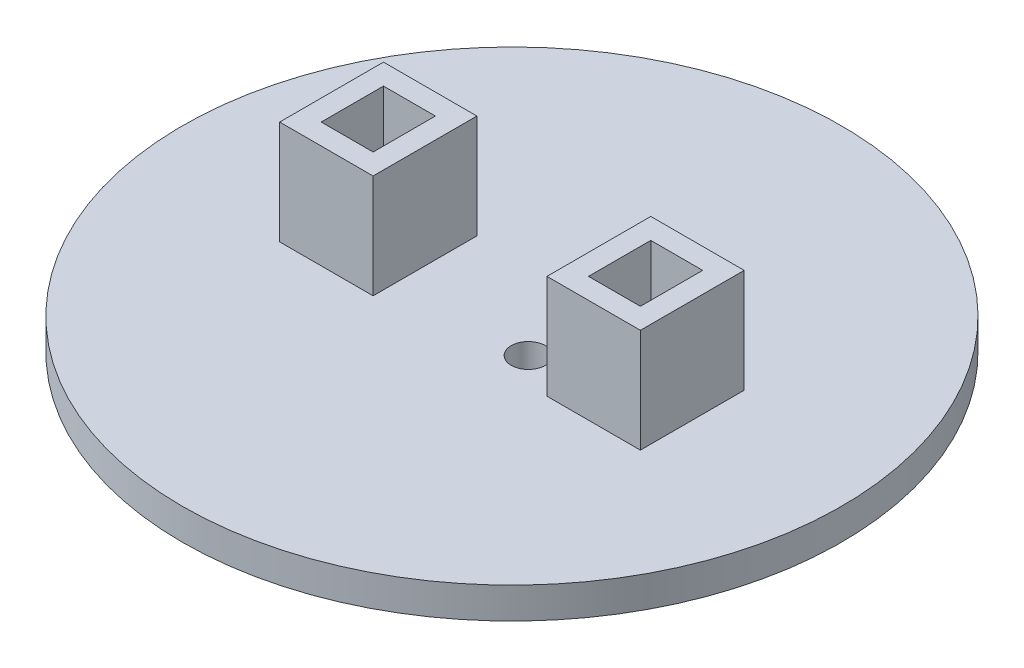
ISO-10303-21;
HEADER;
FILE_DESCRIPTION(('STEP AP214'),'2;1');
FILE_NAME('part.step','',(''),(''),'','','');
FILE_SCHEMA(('AUTOMOTIVE_DESIGN { 1 0 10303 214 1 1 1 1 }'));
ENDSEC;
DATA;
#1=APPLICATION_CONTEXT('core data for automotive mechanical design processes');
#2=APPLICATION_PROTOCOL_DEFINITION('international standard','automotive_design',2000,#1);
#3=PRODUCT_CONTEXT('',#1,'mechanical');
#4=PRODUCT('Part','Part','',(#3));
#5=PRODUCT_RELATED_PRODUCT_CATEGORY('part','',(#4));
#6=PRODUCT_DEFINITION_FORMATION('','',#4);
#7=PRODUCT_DEFINITION_CONTEXT('part definition',#1,'design');
#8=PRODUCT_DEFINITION('design','',#6,#7);
#9=PRODUCT_DEFINITION_SHAPE('','',#8);
#10=(LENGTH_UNIT() NAMED_UNIT(*) SI_UNIT(.MILLI.,.METRE.));
#11=(NAMED_UNIT(*) PLANE_ANGLE_UNIT() SI_UNIT($,.RADIAN.));
#12=(NAMED_UNIT(*) SI_UNIT($,.STERADIAN.) SOLID_ANGLE_UNIT());
#13=UNCERTAINTY_MEASURE_WITH_UNIT(LENGTH_MEASURE(1.E-05),#10,'distance_accuracy_value','');
#14=(GEOMETRIC_REPRESENTATION_CONTEXT(3) GLOBAL_UNCERTAINTY_ASSIGNED_CONTEXT((#13)) GLOBAL_UNIT_ASSIGNED_CONTEXT((#10,
#11,#12)) REPRESENTATION_CONTEXT('',''));
#15=CARTESIAN_POINT('',(0.,0.,0.));
#16=DIRECTION('',(0.,0.,1.));
#17=DIRECTION('',(1.,0.,0.));
#18=AXIS2_PLACEMENT_3D('',#15,#16,#17);
#19=CARTESIAN_POINT('',(0.,3.,0.));
#20=DIRECTION('',(0.,1.,0.));
#21=DIRECTION('',(0.,0.,1.));
#22=AXIS2_PLACEMENT_3D('',#19,#20,#21);
#23=PLANE('',#22);
#24=DIRECTION('',(1.,0.,0.));
#25=VECTOR('',#24,1.);
#26=CARTESIAN_POINT('',(8.375,3.,5.));
#27=LINE('',#26,#25);
#28=CARTESIAN_POINT('',(8.375,3.,5.));
#29=VERTEX_POINT('',#28);
#30=CARTESIAN_POINT('',(17.375,3.,5.));
#31=VERTEX_POINT('',#30);
#32=EDGE_CURVE('E256',#29,#31,#27,.T.);
#33=ORIENTED_EDGE('',*,*,#32,.F.);
#34=DIRECTION('',(0.,0.,1.));
#35=VECTOR('',#34,1.);
#36=CARTESIAN_POINT('',(8.375,3.,-5.));
#37=LINE('',#36,#35);
#38=CARTESIAN_POINT('',(8.375,3.,-5.));
#39=VERTEX_POINT('',#38);
#40=EDGE_CURVE('E237',#39,#29,#37,.T.);
#41=ORIENTED_EDGE('',*,*,#40,.F.);
#42=DIRECTION('',(-1.,0.,0.));
#43=VECTOR('',#42,1.);
#44=CARTESIAN_POINT('',(8.375,3.,-5.));
#45=LINE('',#44,#43);
#46=CARTESIAN_POINT('',(17.375,3.,-5.));
#47=VERTEX_POINT('',#46);
#48=EDGE_CURVE('E243',#47,#39,#45,.T.);
#49=ORIENTED_EDGE('',*,*,#48,.F.);
#50=DIRECTION('',(0.,0.,-1.));
#51=VECTOR('',#50,1.);
#52=CARTESIAN_POINT('',(17.375,3.,-5.));
#53=LINE('',#52,#51);
#54=EDGE_CURVE('E259',#31,#47,#53,.T.);
#55=ORIENTED_EDGE('',*,*,#54,.F.);
#56=EDGE_LOOP('',(#33,#41,#49,#55));
#57=FACE_BOUND('',#56,.T.);
#58=CARTESIAN_POINT('',(4.08,3.,-2.5));
#59=DIRECTION('',(0.,1.,0.));
#60=DIRECTION('',(0.,0.,1.));
#61=AXIS2_PLACEMENT_3D('',#58,#59,#60);
#62=CIRCLE('',#61,1.65);
#63=CARTESIAN_POINT('',(4.08,3.,-0.850000000000001));
#64=VERTEX_POINT('',#63);
#65=EDGE_CURVE('E287',#64,#64,#62,.T.);
#66=ORIENTED_EDGE('',*,*,#65,.F.);
#67=EDGE_LOOP('',(#66));
#68=FACE_BOUND('',#67,.T.);
#69=CARTESIAN_POINT('',(0.,3.,0.));
#70=DIRECTION('',(0.,1.,0.));
#71=DIRECTION('',(0.,0.,1.));
#72=AXIS2_PLACEMENT_3D('',#69,#70,#71);
#73=CIRCLE('',#72,31.75);
#74=CARTESIAN_POINT('',(0.,3.,31.75));
#75=VERTEX_POINT('',#74);
#76=EDGE_CURVE('E11',#75,#75,#73,.T.);
#77=ORIENTED_EDGE('',*,*,#76,.T.);
#78=EDGE_LOOP('',(#77));
#79=FACE_BOUND('',#78,.T.);
#80=CARTESIAN_POINT('',(4.08,3.,2.5));
#81=DIRECTION('',(0.,1.,0.));
#82=DIRECTION('',(0.,0.,1.));
#83=AXIS2_PLACEMENT_3D('',#80,#81,#82);
#84=CIRCLE('',#83,1.65);
#85=CARTESIAN_POINT('',(4.08,3.,4.15));
#86=VERTEX_POINT('',#85);
#87=EDGE_CURVE('E279',#86,#86,#84,.T.);
#88=ORIENTED_EDGE('',*,*,#87,.F.);
#89=EDGE_LOOP('',(#88));
#90=FACE_BOUND('',#89,.T.);
#91=DIRECTION('',(1.,0.,0.));
#92=VECTOR('',#91,1.);
#93=CARTESIAN_POINT('',(-17.375,3.,5.));
#94=LINE('',#93,#92);
#95=CARTESIAN_POINT('',(-17.375,3.,5.));
#96=VERTEX_POINT('',#95);
#97=CARTESIAN_POINT('',(-8.375,3.,5.));
#98=VERTEX_POINT('',#97);
#99=EDGE_CURVE('E621',#96,#98,#94,.T.);
#100=ORIENTED_EDGE('',*,*,#99,.F.);
#101=DIRECTION('',(0.,0.,1.));
#102=VECTOR('',#101,1.);
#103=CARTESIAN_POINT('',(-17.375,3.,-5.));
#104=LINE('',#103,#102);
#105=CARTESIAN_POINT('',(-17.375,3.,-5.));
#106=VERTEX_POINT('',#105);
#107=EDGE_CURVE('E615',#106,#96,#104,.T.);
#108=ORIENTED_EDGE('',*,*,#107,.F.);
#109=DIRECTION('',(-1.,0.,0.));
#110=VECTOR('',#109,1.);
#111=CARTESIAN_POINT('',(-17.375,3.,-5.));
#112=LINE('',#111,#110);
#113=CARTESIAN_POINT('',(-8.375,3.,-5.));
#114=VERTEX_POINT('',#113);
#115=EDGE_CURVE('E633',#114,#106,#112,.T.);
#116=ORIENTED_EDGE('',*,*,#115,.F.);
#117=DIRECTION('',(0.,0.,-1.));
#118=VECTOR('',#117,1.);
#119=CARTESIAN_POINT('',(-8.375,3.,-5.));
#120=LINE('',#119,#118);
#121=EDGE_CURVE('E646',#98,#114,#120,.T.);
#122=ORIENTED_EDGE('',*,*,#121,.F.);
#123=EDGE_LOOP('',(#100,#108,#116,#122));
#124=FACE_BOUND('',#123,.T.);
#125=ADVANCED_FACE('F43',(#57,#68,#79,#90,#124),#23,.T.);
#126=CARTESIAN_POINT('',(0.,0.,0.));
#127=DIRECTION('',(0.,1.,0.));
#128=DIRECTION('',(0.,0.,1.));
#129=AXIS2_PLACEMENT_3D('',#126,#127,#128);
#130=PLANE('',#129);
#131=CARTESIAN_POINT('',(0.,0.,0.));
#132=DIRECTION('',(0.,1.,0.));
#133=DIRECTION('',(0.,0.,1.));
#134=AXIS2_PLACEMENT_3D('',#131,#132,#133);
#135=CIRCLE('',#134,31.75);
#136=CARTESIAN_POINT('',(0.,0.,31.75));
#137=VERTEX_POINT('',#136);
#138=EDGE_CURVE('E47',#137,#137,#135,.T.);
#139=ORIENTED_EDGE('',*,*,#138,.F.);
#140=EDGE_LOOP('',(#139));
#141=FACE_BOUND('',#140,.T.);
#142=CARTESIAN_POINT('',(4.08,0.,-2.5));
#143=DIRECTION('',(0.,1.,0.));
#144=DIRECTION('',(0.,0.,1.));
#145=AXIS2_PLACEMENT_3D('',#142,#143,#144);
#146=CIRCLE('',#145,1.65);
#147=CARTESIAN_POINT('',(4.08,0.,-0.850000000000001));
#148=VERTEX_POINT('',#147);
#149=EDGE_CURVE('E283',#148,#148,#146,.T.);
#150=ORIENTED_EDGE('',*,*,#149,.T.);
#151=EDGE_LOOP('',(#150));
#152=FACE_BOUND('',#151,.T.);
#153=CARTESIAN_POINT('',(4.08,0.,2.5));
#154=DIRECTION('',(0.,1.,0.));
#155=DIRECTION('',(0.,0.,1.));
#156=AXIS2_PLACEMENT_3D('',#153,#154,#155);
#157=CIRCLE('',#156,1.65);
#158=CARTESIAN_POINT('',(4.08,0.,4.15));
#159=VERTEX_POINT('',#158);
#160=EDGE_CURVE('E278',#159,#159,#157,.T.);
#161=ORIENTED_EDGE('',*,*,#160,.T.);
#162=EDGE_LOOP('',(#161));
#163=FACE_BOUND('',#162,.T.);
#164=ADVANCED_FACE('F295',(#141,#152,#163),#130,.F.);
#165=CARTESIAN_POINT('',(0.,3.,0.));
#166=DIRECTION('',(0.,-1.,0.));
#167=DIRECTION('',(0.,0.,-1.));
#168=AXIS2_PLACEMENT_3D('',#165,#166,#167);
#169=CYLINDRICAL_SURFACE('',#168,31.75);
#170=ORIENTED_EDGE('',*,*,#76,.F.);
#171=EDGE_LOOP('',(#170));
#172=FACE_BOUND('',#171,.T.);
#173=ORIENTED_EDGE('',*,*,#138,.T.);
#174=EDGE_LOOP('',(#173));
#175=FACE_BOUND('',#174,.T.);
#176=ADVANCED_FACE('F45',(#172,#175),#169,.T.);
#177=CARTESIAN_POINT('',(4.08,3.,-2.5));
#178=DIRECTION('',(0.,-1.,0.));
#179=DIRECTION('',(0.,0.,-1.));
#180=AXIS2_PLACEMENT_3D('',#177,#178,#179);
#181=CYLINDRICAL_SURFACE('',#180,1.65);
#182=ORIENTED_EDGE('',*,*,#65,.T.);
#183=EDGE_LOOP('',(#182));
#184=FACE_BOUND('',#183,.T.);
#185=ORIENTED_EDGE('',*,*,#149,.F.);
#186=EDGE_LOOP('',(#185));
#187=FACE_BOUND('',#186,.T.);
#188=ADVANCED_FACE('F298',(#184,#187),#181,.F.);
#189=CARTESIAN_POINT('',(4.08,3.,2.5));
#190=DIRECTION('',(0.,-1.,0.));
#191=DIRECTION('',(0.,0.,-1.));
#192=AXIS2_PLACEMENT_3D('',#189,#190,#191);
#193=CYLINDRICAL_SURFACE('',#192,1.65);
#194=ORIENTED_EDGE('',*,*,#87,.T.);
#195=EDGE_LOOP('',(#194));
#196=FACE_BOUND('',#195,.T.);
#197=ORIENTED_EDGE('',*,*,#160,.F.);
#198=EDGE_LOOP('',(#197));
#199=FACE_BOUND('',#198,.T.);
#200=ADVANCED_FACE('F300',(#196,#199),#193,.F.);
#201=CARTESIAN_POINT('',(0.,13.,0.));
#202=DIRECTION('',(0.,1.,0.));
#203=DIRECTION('',(0.,0.,1.));
#204=AXIS2_PLACEMENT_3D('',#201,#202,#203);
#205=PLANE('',#204);
#206=DIRECTION('',(0.,0.,1.));
#207=VECTOR('',#206,1.);
#208=CARTESIAN_POINT('',(8.375,13.,-5.));
#209=LINE('',#208,#207);
#210=CARTESIAN_POINT('',(8.375,13.,-5.));
#211=VERTEX_POINT('',#210);
#212=CARTESIAN_POINT('',(8.375,13.,5.));
#213=VERTEX_POINT('',#212);
#214=EDGE_CURVE('E238',#211,#213,#209,.T.);
#215=ORIENTED_EDGE('',*,*,#214,.T.);
#216=DIRECTION('',(1.,0.,0.));
#217=VECTOR('',#216,1.);
#218=CARTESIAN_POINT('',(8.375,13.,5.));
#219=LINE('',#218,#217);
#220=CARTESIAN_POINT('',(17.375,13.,5.));
#221=VERTEX_POINT('',#220);
#222=EDGE_CURVE('E242',#213,#221,#219,.T.);
#223=ORIENTED_EDGE('',*,*,#222,.T.);
#224=DIRECTION('',(0.,0.,-1.));
#225=VECTOR('',#224,1.);
#226=CARTESIAN_POINT('',(17.375,13.,-5.));
#227=LINE('',#226,#225);
#228=CARTESIAN_POINT('',(17.375,13.,-5.));
#229=VERTEX_POINT('',#228);
#230=EDGE_CURVE('E246',#221,#229,#227,.T.);
#231=ORIENTED_EDGE('',*,*,#230,.T.);
#232=DIRECTION('',(-1.,0.,0.));
#233=VECTOR('',#232,1.);
#234=CARTESIAN_POINT('',(8.375,13.,-5.));
#235=LINE('',#234,#233);
#236=EDGE_CURVE('E249',#229,#211,#235,.T.);
#237=ORIENTED_EDGE('',*,*,#236,.T.);
#238=EDGE_LOOP('',(#215,#223,#231,#237));
#239=FACE_BOUND('',#238,.T.);
#240=DIRECTION('',(1.,0.,0.));
#241=VECTOR('',#240,1.);
#242=CARTESIAN_POINT('',(10.375,13.,3.));
#243=LINE('',#242,#241);
#244=CARTESIAN_POINT('',(10.375,13.,3.));
#245=VERTEX_POINT('',#244);
#246=CARTESIAN_POINT('',(15.375,13.,3.));
#247=VERTEX_POINT('',#246);
#248=EDGE_CURVE('E199',#245,#247,#243,.T.);
#249=ORIENTED_EDGE('',*,*,#248,.F.);
#250=DIRECTION('',(0.,0.,1.));
#251=VECTOR('',#250,1.);
#252=CARTESIAN_POINT('',(10.375,13.,-3.));
#253=LINE('',#252,#251);
#254=CARTESIAN_POINT('',(10.375,13.,-3.));
#255=VERTEX_POINT('',#254);
#256=EDGE_CURVE('E196',#255,#245,#253,.T.);
#257=ORIENTED_EDGE('',*,*,#256,.F.);
#258=DIRECTION('',(-1.,0.,0.));
#259=VECTOR('',#258,1.);
#260=CARTESIAN_POINT('',(10.375,13.,-3.));
#261=LINE('',#260,#259);
#262=CARTESIAN_POINT('',(15.375,13.,-3.));
#263=VERTEX_POINT('',#262);
#264=EDGE_CURVE('E207',#263,#255,#261,.T.);
#265=ORIENTED_EDGE('',*,*,#264,.F.);
#266=DIRECTION('',(0.,0.,-1.));
#267=VECTOR('',#266,1.);
#268=CARTESIAN_POINT('',(15.375,13.,-3.));
#269=LINE('',#268,#267);
#270=EDGE_CURVE('E203',#247,#263,#269,.T.);
#271=ORIENTED_EDGE('',*,*,#270,.F.);
#272=EDGE_LOOP('',(#249,#257,#265,#271));
#273=FACE_BOUND('',#272,.T.);
#274=ADVANCED_FACE('F307',(#239,#273),#205,.T.);
#275=CARTESIAN_POINT('',(8.375,13.,-5.));
#276=DIRECTION('',(1.,0.,0.));
#277=DIRECTION('',(0.,0.,-1.));
#278=AXIS2_PLACEMENT_3D('',#275,#276,#277);
#279=PLANE('',#278);
#280=ORIENTED_EDGE('',*,*,#40,.T.);
#281=DIRECTION('',(0.,-1.,0.));
#282=VECTOR('',#281,1.);
#283=CARTESIAN_POINT('',(8.375,13.,5.));
#284=LINE('',#283,#282);
#285=EDGE_CURVE('E275',#213,#29,#284,.T.);
#286=ORIENTED_EDGE('',*,*,#285,.F.);
#287=ORIENTED_EDGE('',*,*,#214,.F.);
#288=DIRECTION('',(0.,-1.,0.));
#289=VECTOR('',#288,1.);
#290=CARTESIAN_POINT('',(8.375,13.,-5.));
#291=LINE('',#290,#289);
#292=EDGE_CURVE('E252',#211,#39,#291,.T.);
#293=ORIENTED_EDGE('',*,*,#292,.T.);
#294=EDGE_LOOP('',(#280,#286,#287,#293));
#295=FACE_BOUND('',#294,.T.);
#296=ADVANCED_FACE('F366',(#295),#279,.F.);
#297=CARTESIAN_POINT('',(8.375,13.,5.));
#298=DIRECTION('',(0.,0.,-1.));
#299=DIRECTION('',(-1.,0.,0.));
#300=AXIS2_PLACEMENT_3D('',#297,#298,#299);
#301=PLANE('',#300);
#302=ORIENTED_EDGE('',*,*,#32,.T.);
#303=DIRECTION('',(0.,-1.,0.));
#304=VECTOR('',#303,1.);
#305=CARTESIAN_POINT('',(17.375,13.,5.));
#306=LINE('',#305,#304);
#307=EDGE_CURVE('E271',#221,#31,#306,.T.);
#308=ORIENTED_EDGE('',*,*,#307,.F.);
#309=ORIENTED_EDGE('',*,*,#222,.F.);
#310=ORIENTED_EDGE('',*,*,#285,.T.);
#311=EDGE_LOOP('',(#302,#308,#309,#310));
#312=FACE_BOUND('',#311,.T.);
#313=ADVANCED_FACE('F374',(#312),#301,.F.);
#314=CARTESIAN_POINT('',(17.375,13.,-5.));
#315=DIRECTION('',(-1.,0.,0.));
#316=DIRECTION('',(0.,0.,1.));
#317=AXIS2_PLACEMENT_3D('',#314,#315,#316);
#318=PLANE('',#317);
#319=ORIENTED_EDGE('',*,*,#54,.T.);
#320=DIRECTION('',(0.,-1.,0.));
#321=VECTOR('',#320,1.);
#322=CARTESIAN_POINT('',(17.375,13.,-5.));
#323=LINE('',#322,#321);
#324=EDGE_CURVE('E268',#229,#47,#323,.T.);
#325=ORIENTED_EDGE('',*,*,#324,.F.);
#326=ORIENTED_EDGE('',*,*,#230,.F.);
#327=ORIENTED_EDGE('',*,*,#307,.T.);
#328=EDGE_LOOP('',(#319,#325,#326,#327));
#329=FACE_BOUND('',#328,.T.);
#330=ADVANCED_FACE('F370',(#329),#318,.F.);
#331=CARTESIAN_POINT('',(8.375,13.,-5.));
#332=DIRECTION('',(0.,0.,1.));
#333=DIRECTION('',(1.,0.,0.));
#334=AXIS2_PLACEMENT_3D('',#331,#332,#333);
#335=PLANE('',#334);
#336=ORIENTED_EDGE('',*,*,#48,.T.);
#337=ORIENTED_EDGE('',*,*,#292,.F.);
#338=ORIENTED_EDGE('',*,*,#236,.F.);
#339=ORIENTED_EDGE('',*,*,#324,.T.);
#340=EDGE_LOOP('',(#336,#337,#338,#339));
#341=FACE_BOUND('',#340,.T.);
#342=ADVANCED_FACE('F363',(#341),#335,.F.);
#343=CARTESIAN_POINT('',(10.375,13.,-3.));
#344=DIRECTION('',(1.,0.,0.));
#345=DIRECTION('',(0.,0.,-1.));
#346=AXIS2_PLACEMENT_3D('',#343,#344,#345);
#347=PLANE('',#346);
#348=DIRECTION('',(0.,0.,1.));
#349=VECTOR('',#348,1.);
#350=CARTESIAN_POINT('',(10.375,3.,-3.));
#351=LINE('',#350,#349);
#352=CARTESIAN_POINT('',(10.375,3.,-3.));
#353=VERTEX_POINT('',#352);
#354=CARTESIAN_POINT('',(10.375,3.,3.));
#355=VERTEX_POINT('',#354);
#356=EDGE_CURVE('E211',#353,#355,#351,.T.);
#357=ORIENTED_EDGE('',*,*,#356,.F.);
#358=DIRECTION('',(0.,-1.,0.));
#359=VECTOR('',#358,1.);
#360=CARTESIAN_POINT('',(10.375,13.,-3.));
#361=LINE('',#360,#359);
#362=EDGE_CURVE('E210',#255,#353,#361,.T.);
#363=ORIENTED_EDGE('',*,*,#362,.F.);
#364=ORIENTED_EDGE('',*,*,#256,.T.);
#365=DIRECTION('',(0.,-1.,0.));
#366=VECTOR('',#365,1.);
#367=CARTESIAN_POINT('',(10.375,13.,3.));
#368=LINE('',#367,#366);
#369=EDGE_CURVE('E233',#245,#355,#368,.T.);
#370=ORIENTED_EDGE('',*,*,#369,.T.);
#371=EDGE_LOOP('',(#357,#363,#364,#370));
#372=FACE_BOUND('',#371,.T.);
#373=ADVANCED_FACE('F347',(#372),#347,.T.);
#374=CARTESIAN_POINT('',(10.375,13.,3.));
#375=DIRECTION('',(0.,0.,-1.));
#376=DIRECTION('',(-1.,0.,0.));
#377=AXIS2_PLACEMENT_3D('',#374,#375,#376);
#378=PLANE('',#377);
#379=DIRECTION('',(1.,0.,0.));
#380=VECTOR('',#379,1.);
#381=CARTESIAN_POINT('',(10.375,3.,3.));
#382=LINE('',#381,#380);
#383=CARTESIAN_POINT('',(15.375,3.,3.));
#384=VERTEX_POINT('',#383);
#385=EDGE_CURVE('E214',#355,#384,#382,.T.);
#386=ORIENTED_EDGE('',*,*,#385,.F.);
#387=ORIENTED_EDGE('',*,*,#369,.F.);
#388=ORIENTED_EDGE('',*,*,#248,.T.);
#389=DIRECTION('',(0.,-1.,0.));
#390=VECTOR('',#389,1.);
#391=CARTESIAN_POINT('',(15.375,13.,3.));
#392=LINE('',#391,#390);
#393=EDGE_CURVE('E229',#247,#384,#392,.T.);
#394=ORIENTED_EDGE('',*,*,#393,.T.);
#395=EDGE_LOOP('',(#386,#387,#388,#394));
#396=FACE_BOUND('',#395,.T.);
#397=ADVANCED_FACE('F343',(#396),#378,.T.);
#398=CARTESIAN_POINT('',(15.375,13.,-3.));
#399=DIRECTION('',(-1.,0.,0.));
#400=DIRECTION('',(0.,0.,1.));
#401=AXIS2_PLACEMENT_3D('',#398,#399,#400);
#402=PLANE('',#401);
#403=DIRECTION('',(0.,0.,-1.));
#404=VECTOR('',#403,1.);
#405=CARTESIAN_POINT('',(15.375,3.,-3.));
#406=LINE('',#405,#404);
#407=CARTESIAN_POINT('',(15.375,3.,-3.));
#408=VERTEX_POINT('',#407);
#409=EDGE_CURVE('E217',#384,#408,#406,.T.);
#410=ORIENTED_EDGE('',*,*,#409,.F.);
#411=ORIENTED_EDGE('',*,*,#393,.F.);
#412=ORIENTED_EDGE('',*,*,#270,.T.);
#413=DIRECTION('',(0.,-1.,0.));
#414=VECTOR('',#413,1.);
#415=CARTESIAN_POINT('',(15.375,13.,-3.));
#416=LINE('',#415,#414);
#417=EDGE_CURVE('E225',#263,#408,#416,.T.);
#418=ORIENTED_EDGE('',*,*,#417,.T.);
#419=EDGE_LOOP('',(#410,#411,#412,#418));
#420=FACE_BOUND('',#419,.T.);
#421=ADVANCED_FACE('F333',(#420),#402,.T.);
#422=CARTESIAN_POINT('',(10.375,13.,-3.));
#423=DIRECTION('',(0.,0.,1.));
#424=DIRECTION('',(1.,0.,0.));
#425=AXIS2_PLACEMENT_3D('',#422,#423,#424);
#426=PLANE('',#425);
#427=DIRECTION('',(-1.,0.,0.));
#428=VECTOR('',#427,1.);
#429=CARTESIAN_POINT('',(10.375,3.,-3.));
#430=LINE('',#429,#428);
#431=EDGE_CURVE('E200',#408,#353,#430,.T.);
#432=ORIENTED_EDGE('',*,*,#431,.F.);
#433=ORIENTED_EDGE('',*,*,#417,.F.);
#434=ORIENTED_EDGE('',*,*,#264,.T.);
#435=ORIENTED_EDGE('',*,*,#362,.T.);
#436=EDGE_LOOP('',(#432,#433,#434,#435));
#437=FACE_BOUND('',#436,.T.);
#438=ADVANCED_FACE('F324',(#437),#426,.T.);
#439=ORIENTED_EDGE('',*,*,#356,.T.);
#440=ORIENTED_EDGE('',*,*,#385,.T.);
#441=ORIENTED_EDGE('',*,*,#409,.T.);
#442=ORIENTED_EDGE('',*,*,#431,.T.);
#443=EDGE_LOOP('',(#439,#440,#441,#442));
#444=FACE_BOUND('',#443,.T.);
#445=ADVANCED_FACE('F315',(#444),#23,.T.);
#446=CARTESIAN_POINT('',(0.,13.,0.));
#447=DIRECTION('',(0.,1.,0.));
#448=DIRECTION('',(0.,0.,1.));
#449=AXIS2_PLACEMENT_3D('',#446,#447,#448);
#450=PLANE('',#449);
#451=DIRECTION('',(0.,0.,1.));
#452=VECTOR('',#451,1.);
#453=CARTESIAN_POINT('',(-17.375,13.,-5.));
#454=LINE('',#453,#452);
#455=CARTESIAN_POINT('',(-17.375,13.,-5.));
#456=VERTEX_POINT('',#455);
#457=CARTESIAN_POINT('',(-17.375,13.,5.));
#458=VERTEX_POINT('',#457);
#459=EDGE_CURVE('E624',#456,#458,#454,.T.);
#460=ORIENTED_EDGE('',*,*,#459,.T.);
#461=DIRECTION('',(1.,0.,0.));
#462=VECTOR('',#461,1.);
#463=CARTESIAN_POINT('',(-17.375,13.,5.));
#464=LINE('',#463,#462);
#465=CARTESIAN_POINT('',(-8.375,13.,5.));
#466=VERTEX_POINT('',#465);
#467=EDGE_CURVE('E634',#458,#466,#464,.T.);
#468=ORIENTED_EDGE('',*,*,#467,.T.);
#469=DIRECTION('',(0.,0.,-1.));
#470=VECTOR('',#469,1.);
#471=CARTESIAN_POINT('',(-8.375,13.,-5.));
#472=LINE('',#471,#470);
#473=CARTESIAN_POINT('',(-8.375,13.,-5.));
#474=VERTEX_POINT('',#473);
#475=EDGE_CURVE('E637',#466,#474,#472,.T.);
#476=ORIENTED_EDGE('',*,*,#475,.T.);
#477=DIRECTION('',(-1.,0.,0.));
#478=VECTOR('',#477,1.);
#479=CARTESIAN_POINT('',(-17.375,13.,-5.));
#480=LINE('',#479,#478);
#481=EDGE_CURVE('E640',#474,#456,#480,.T.);
#482=ORIENTED_EDGE('',*,*,#481,.T.);
#483=EDGE_LOOP('',(#460,#468,#476,#482));
#484=FACE_BOUND('',#483,.T.);
#485=DIRECTION('',(1.,0.,0.));
#486=VECTOR('',#485,1.);
#487=CARTESIAN_POINT('',(-15.375,13.,3.));
#488=LINE('',#487,#486);
#489=CARTESIAN_POINT('',(-15.375,13.,3.));
#490=VERTEX_POINT('',#489);
#491=CARTESIAN_POINT('',(-10.375,13.,3.));
#492=VERTEX_POINT('',#491);
#493=EDGE_CURVE('E180',#490,#492,#488,.T.);
#494=ORIENTED_EDGE('',*,*,#493,.F.);
#495=DIRECTION('',(0.,0.,1.));
#496=VECTOR('',#495,1.);
#497=CARTESIAN_POINT('',(-15.375,13.,-3.));
#498=LINE('',#497,#496);
#499=CARTESIAN_POINT('',(-15.375,13.,-3.));
#500=VERTEX_POINT('',#499);
#501=EDGE_CURVE('E184',#500,#490,#498,.T.);
#502=ORIENTED_EDGE('',*,*,#501,.F.);
#503=DIRECTION('',(-1.,0.,0.));
#504=VECTOR('',#503,1.);
#505=CARTESIAN_POINT('',(-15.375,13.,-3.));
#506=LINE('',#505,#504);
#507=CARTESIAN_POINT('',(-10.375,13.,-3.));
#508=VERTEX_POINT('',#507);
#509=EDGE_CURVE('E163',#508,#500,#506,.T.);
#510=ORIENTED_EDGE('',*,*,#509,.F.);
#511=DIRECTION('',(0.,0.,-1.));
#512=VECTOR('',#511,1.);
#513=CARTESIAN_POINT('',(-10.375,13.,-3.));
#514=LINE('',#513,#512);
#515=EDGE_CURVE('E174',#492,#508,#514,.T.);
#516=ORIENTED_EDGE('',*,*,#515,.F.);
#517=EDGE_LOOP('',(#494,#502,#510,#516));
#518=FACE_BOUND('',#517,.T.);
#519=ADVANCED_FACE('F183',(#484,#518),#450,.T.);
#520=CARTESIAN_POINT('',(-17.375,13.,-5.));
#521=DIRECTION('',(1.,0.,0.));
#522=DIRECTION('',(0.,0.,-1.));
#523=AXIS2_PLACEMENT_3D('',#520,#521,#522);
#524=PLANE('',#523);
#525=ORIENTED_EDGE('',*,*,#107,.T.);
#526=DIRECTION('',(0.,-1.,0.));
#527=VECTOR('',#526,1.);
#528=CARTESIAN_POINT('',(-17.375,13.,5.));
#529=LINE('',#528,#527);
#530=EDGE_CURVE('E660',#458,#96,#529,.T.);
#531=ORIENTED_EDGE('',*,*,#530,.F.);
#532=ORIENTED_EDGE('',*,*,#459,.F.);
#533=DIRECTION('',(0.,-1.,0.));
#534=VECTOR('',#533,1.);
#535=CARTESIAN_POINT('',(-17.375,13.,-5.));
#536=LINE('',#535,#534);
#537=EDGE_CURVE('E642',#456,#106,#536,.T.);
#538=ORIENTED_EDGE('',*,*,#537,.T.);
#539=EDGE_LOOP('',(#525,#531,#532,#538));
#540=FACE_BOUND('',#539,.T.);
#541=ADVANCED_FACE('F330',(#540),#524,.F.);
#542=CARTESIAN_POINT('',(-17.375,13.,5.));
#543=DIRECTION('',(0.,0.,-1.));
#544=DIRECTION('',(-1.,0.,0.));
#545=AXIS2_PLACEMENT_3D('',#542,#543,#544);
#546=PLANE('',#545);
#547=ORIENTED_EDGE('',*,*,#99,.T.);
#548=DIRECTION('',(0.,-1.,0.));
#549=VECTOR('',#548,1.);
#550=CARTESIAN_POINT('',(-8.375,13.,5.));
#551=LINE('',#550,#549);
#552=EDGE_CURVE('E656',#466,#98,#551,.T.);
#553=ORIENTED_EDGE('',*,*,#552,.F.);
#554=ORIENTED_EDGE('',*,*,#467,.F.);
#555=ORIENTED_EDGE('',*,*,#530,.T.);
#556=EDGE_LOOP('',(#547,#553,#554,#555));
#557=FACE_BOUND('',#556,.T.);
#558=ADVANCED_FACE('F450',(#557),#546,.F.);
#559=CARTESIAN_POINT('',(-8.375,13.,-5.));
#560=DIRECTION('',(-1.,0.,0.));
#561=DIRECTION('',(0.,0.,1.));
#562=AXIS2_PLACEMENT_3D('',#559,#560,#561);
#563=PLANE('',#562);
#564=ORIENTED_EDGE('',*,*,#121,.T.);
#565=DIRECTION('',(0.,-1.,0.));
#566=VECTOR('',#565,1.);
#567=CARTESIAN_POINT('',(-8.375,13.,-5.));
#568=LINE('',#567,#566);
#569=EDGE_CURVE('E59',#474,#114,#568,.T.);
#570=ORIENTED_EDGE('',*,*,#569,.F.);
#571=ORIENTED_EDGE('',*,*,#475,.F.);
#572=ORIENTED_EDGE('',*,*,#552,.T.);
#573=EDGE_LOOP('',(#564,#570,#571,#572));
#574=FACE_BOUND('',#573,.T.);
#575=ADVANCED_FACE('F461',(#574),#563,.F.);
#576=CARTESIAN_POINT('',(-17.375,13.,-5.));
#577=DIRECTION('',(0.,0.,1.));
#578=DIRECTION('',(1.,0.,0.));
#579=AXIS2_PLACEMENT_3D('',#576,#577,#578);
#580=PLANE('',#579);
#581=ORIENTED_EDGE('',*,*,#115,.T.);
#582=ORIENTED_EDGE('',*,*,#537,.F.);
#583=ORIENTED_EDGE('',*,*,#481,.F.);
#584=ORIENTED_EDGE('',*,*,#569,.T.);
#585=EDGE_LOOP('',(#581,#582,#583,#584));
#586=FACE_BOUND('',#585,.T.);
#587=ADVANCED_FACE('F472',(#586),#580,.F.);
#588=CARTESIAN_POINT('',(-15.375,13.,-3.));
#589=DIRECTION('',(1.,0.,0.));
#590=DIRECTION('',(0.,0.,-1.));
#591=AXIS2_PLACEMENT_3D('',#588,#589,#590);
#592=PLANE('',#591);
#593=DIRECTION('',(0.,0.,1.));
#594=VECTOR('',#593,1.);
#595=CARTESIAN_POINT('',(-15.375,3.,-3.));
#596=LINE('',#595,#594);
#597=CARTESIAN_POINT('',(-15.375,3.,-3.));
#598=VERTEX_POINT('',#597);
#599=CARTESIAN_POINT('',(-15.375,3.,3.));
#600=VERTEX_POINT('',#599);
#601=EDGE_CURVE('E67',#598,#600,#596,.T.);
#602=ORIENTED_EDGE('',*,*,#601,.F.);
#603=DIRECTION('',(0.,-1.,0.));
#604=VECTOR('',#603,1.);
#605=CARTESIAN_POINT('',(-15.375,13.,-3.));
#606=LINE('',#605,#604);
#607=EDGE_CURVE('E169',#500,#598,#606,.T.);
#608=ORIENTED_EDGE('',*,*,#607,.F.);
#609=ORIENTED_EDGE('',*,*,#501,.T.);
#610=DIRECTION('',(0.,-1.,0.));
#611=VECTOR('',#610,1.);
#612=CARTESIAN_POINT('',(-15.375,13.,3.));
#613=LINE('',#612,#611);
#614=EDGE_CURVE('E611',#490,#600,#613,.T.);
#615=ORIENTED_EDGE('',*,*,#614,.T.);
#616=EDGE_LOOP('',(#602,#608,#609,#615));
#617=FACE_BOUND('',#616,.T.);
#618=ADVANCED_FACE('F483',(#617),#592,.T.);
#619=CARTESIAN_POINT('',(-15.375,13.,3.));
#620=DIRECTION('',(0.,0.,-1.));
#621=DIRECTION('',(-1.,0.,0.));
#622=AXIS2_PLACEMENT_3D('',#619,#620,#621);
#623=PLANE('',#622);
#624=DIRECTION('',(1.,0.,0.));
#625=VECTOR('',#624,1.);
#626=CARTESIAN_POINT('',(-15.375,3.,3.));
#627=LINE('',#626,#625);
#628=CARTESIAN_POINT('',(-10.375,3.,3.));
#629=VERTEX_POINT('',#628);
#630=EDGE_CURVE('E609',#600,#629,#627,.T.);
#631=ORIENTED_EDGE('',*,*,#630,.F.);
#632=ORIENTED_EDGE('',*,*,#614,.F.);
#633=ORIENTED_EDGE('',*,*,#493,.T.);
#634=DIRECTION('',(0.,-1.,0.));
#635=VECTOR('',#634,1.);
#636=CARTESIAN_POINT('',(-10.375,13.,3.));
#637=LINE('',#636,#635);
#638=EDGE_CURVE('E170',#492,#629,#637,.T.);
#639=ORIENTED_EDGE('',*,*,#638,.T.);
#640=EDGE_LOOP('',(#631,#632,#633,#639));
#641=FACE_BOUND('',#640,.T.);
#642=ADVANCED_FACE('F493',(#641),#623,.T.);
#643=CARTESIAN_POINT('',(-10.375,13.,-3.));
#644=DIRECTION('',(-1.,0.,0.));
#645=DIRECTION('',(0.,0.,1.));
#646=AXIS2_PLACEMENT_3D('',#643,#644,#645);
#647=PLANE('',#646);
#648=DIRECTION('',(0.,0.,-1.));
#649=VECTOR('',#648,1.);
#650=CARTESIAN_POINT('',(-10.375,3.,-3.));
#651=LINE('',#650,#649);
#652=CARTESIAN_POINT('',(-10.375,3.,-3.));
#653=VERTEX_POINT('',#652);
#654=EDGE_CURVE('E613',#629,#653,#651,.T.);
#655=ORIENTED_EDGE('',*,*,#654,.F.);
#656=ORIENTED_EDGE('',*,*,#638,.F.);
#657=ORIENTED_EDGE('',*,*,#515,.T.);
#658=DIRECTION('',(0.,-1.,0.));
#659=VECTOR('',#658,1.);
#660=CARTESIAN_POINT('',(-10.375,13.,-3.));
#661=LINE('',#660,#659);
#662=EDGE_CURVE('E158',#508,#653,#661,.T.);
#663=ORIENTED_EDGE('',*,*,#662,.T.);
#664=EDGE_LOOP('',(#655,#656,#657,#663));
#665=FACE_BOUND('',#664,.T.);
#666=ADVANCED_FACE('F175',(#665),#647,.T.);
#667=CARTESIAN_POINT('',(-15.375,13.,-3.));
#668=DIRECTION('',(0.,0.,1.));
#669=DIRECTION('',(1.,0.,0.));
#670=AXIS2_PLACEMENT_3D('',#667,#668,#669);
#671=PLANE('',#670);
#672=DIRECTION('',(-1.,0.,0.));
#673=VECTOR('',#672,1.);
#674=CARTESIAN_POINT('',(-15.375,3.,-3.));
#675=LINE('',#674,#673);
#676=EDGE_CURVE('E165',#653,#598,#675,.T.);
#677=ORIENTED_EDGE('',*,*,#676,.F.);
#678=ORIENTED_EDGE('',*,*,#662,.F.);
#679=ORIENTED_EDGE('',*,*,#509,.T.);
#680=ORIENTED_EDGE('',*,*,#607,.T.);
#681=EDGE_LOOP('',(#677,#678,#679,#680));
#682=FACE_BOUND('',#681,.T.);
#683=ADVANCED_FACE('F160',(#682),#671,.T.);
#684=ORIENTED_EDGE('',*,*,#601,.T.);
#685=ORIENTED_EDGE('',*,*,#630,.T.);
#686=ORIENTED_EDGE('',*,*,#654,.T.);
#687=ORIENTED_EDGE('',*,*,#676,.T.);
#688=EDGE_LOOP('',(#684,#685,#686,#687));
#689=FACE_BOUND('',#688,.T.);
#690=ADVANCED_FACE('F314',(#689),#23,.T.);
#691=CLOSED_SHELL('',(#125,#164,#176,#188,#200,#274,#296,#313,#330,#342,#373,#397,#421,#438,
#445,#519,#541,#558,#575,#587,#618,#642,#666,#683,#690));
#692=MANIFOLD_SOLID_BREP('B2',#691);
#693=ADVANCED_BREP_SHAPE_REPRESENTATION('',(#18,#692),#14);
#694=SHAPE_DEFINITION_REPRESENTATION(#9,#693);
ENDSEC;
END-ISO-10303-21;
